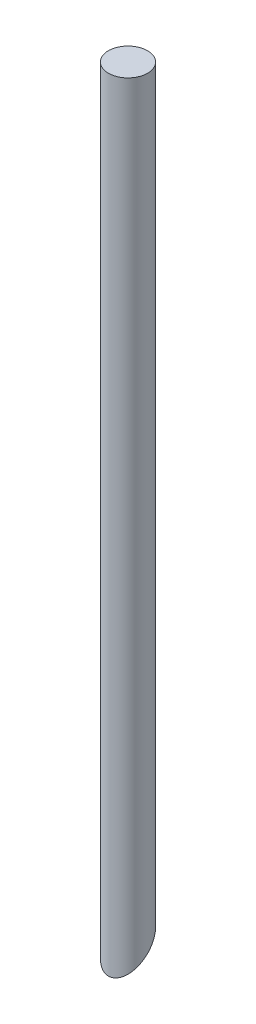
ISO-10303-21;
HEADER;
FILE_DESCRIPTION(('STEP AP214'),'2;1');
FILE_NAME('part.step','',(''),(''),'','','');
FILE_SCHEMA(('AUTOMOTIVE_DESIGN { 1 0 10303 214 1 1 1 1 }'));
ENDSEC;
DATA;
#1=APPLICATION_CONTEXT('core data for automotive mechanical design processes');
#2=APPLICATION_PROTOCOL_DEFINITION('international standard','automotive_design',2000,#1);
#3=PRODUCT_CONTEXT('',#1,'mechanical');
#4=PRODUCT('Part','Part','',(#3));
#5=PRODUCT_RELATED_PRODUCT_CATEGORY('part','',(#4));
#6=PRODUCT_DEFINITION_FORMATION('','',#4);
#7=PRODUCT_DEFINITION_CONTEXT('part definition',#1,'design');
#8=PRODUCT_DEFINITION('design','',#6,#7);
#9=PRODUCT_DEFINITION_SHAPE('','',#8);
#10=(LENGTH_UNIT() NAMED_UNIT(*) SI_UNIT(.MILLI.,.METRE.));
#11=(NAMED_UNIT(*) PLANE_ANGLE_UNIT() SI_UNIT($,.RADIAN.));
#12=(NAMED_UNIT(*) SI_UNIT($,.STERADIAN.) SOLID_ANGLE_UNIT());
#13=UNCERTAINTY_MEASURE_WITH_UNIT(LENGTH_MEASURE(1.E-05),#10,'distance_accuracy_value','');
#14=(GEOMETRIC_REPRESENTATION_CONTEXT(3) GLOBAL_UNCERTAINTY_ASSIGNED_CONTEXT((#13)) GLOBAL_UNIT_ASSIGNED_CONTEXT((#10,
#11,#12)) REPRESENTATION_CONTEXT('',''));
#15=CARTESIAN_POINT('',(0.,0.,0.));
#16=DIRECTION('',(0.,0.,1.));
#17=DIRECTION('',(1.,0.,0.));
#18=AXIS2_PLACEMENT_3D('',#15,#16,#17);
#19=CARTESIAN_POINT('',(0.,200.,0.));
#20=DIRECTION('',(0.,-1.,0.));
#21=DIRECTION('',(0.,0.,-1.));
#22=AXIS2_PLACEMENT_3D('',#19,#20,#21);
#23=CYLINDRICAL_SURFACE('',#22,5.);
#24=CARTESIAN_POINT('',(0.,200.,0.));
#25=DIRECTION('',(0.,1.,0.));
#26=DIRECTION('',(0.,0.,1.));
#27=AXIS2_PLACEMENT_3D('',#24,#25,#26);
#28=CIRCLE('',#27,5.);
#29=CARTESIAN_POINT('',(0.,200.,5.));
#30=VERTEX_POINT('',#29);
#31=EDGE_CURVE('E10',#30,#30,#28,.T.);
#32=ORIENTED_EDGE('',*,*,#31,.F.);
#33=EDGE_LOOP('',(#32));
#34=FACE_BOUND('',#33,.T.);
#35=CARTESIAN_POINT('',(0.,5.00000000000003,0.));
#36=DIRECTION('',(0.,0.707106781186546,0.707106781186549));
#37=DIRECTION('',(0.,-0.707106781186549,0.707106781186546));
#38=AXIS2_PLACEMENT_3D('',#35,#36,#37);
#39=ELLIPSE('',#38,7.07106781186549,5.);
#40=CARTESIAN_POINT('',(0.,0.,5.));
#41=VERTEX_POINT('',#40);
#42=EDGE_CURVE('E44',#41,#41,#39,.T.);
#43=ORIENTED_EDGE('',*,*,#42,.T.);
#44=EDGE_LOOP('',(#43));
#45=FACE_BOUND('',#44,.T.);
#46=ADVANCED_FACE('F37',(#34,#45),#23,.T.);
#47=CARTESIAN_POINT('',(0.,200.,0.));
#48=DIRECTION('',(0.,1.,0.));
#49=DIRECTION('',(0.,0.,1.));
#50=AXIS2_PLACEMENT_3D('',#47,#48,#49);
#51=PLANE('',#50);
#52=ORIENTED_EDGE('',*,*,#31,.T.);
#53=EDGE_LOOP('',(#52));
#54=FACE_BOUND('',#53,.T.);
#55=ADVANCED_FACE('F54',(#54),#51,.T.);
#56=CARTESIAN_POINT('',(-5.,0.,5.));
#57=DIRECTION('',(0.,0.707106781186546,0.707106781186549));
#58=DIRECTION('',(0.,-0.707106781186549,0.707106781186546));
#59=AXIS2_PLACEMENT_3D('',#56,#57,#58);
#60=PLANE('',#59);
#61=ORIENTED_EDGE('',*,*,#42,.F.);
#62=EDGE_LOOP('',(#61));
#63=FACE_BOUND('',#62,.T.);
#64=ADVANCED_FACE('F52',(#63),#60,.F.);
#65=CLOSED_SHELL('',(#46,#55,#64));
#66=MANIFOLD_SOLID_BREP('B2',#65);
#67=ADVANCED_BREP_SHAPE_REPRESENTATION('',(#18,#66),#14);
#68=SHAPE_DEFINITION_REPRESENTATION(#9,#67);
ENDSEC;
END-ISO-10303-21;
